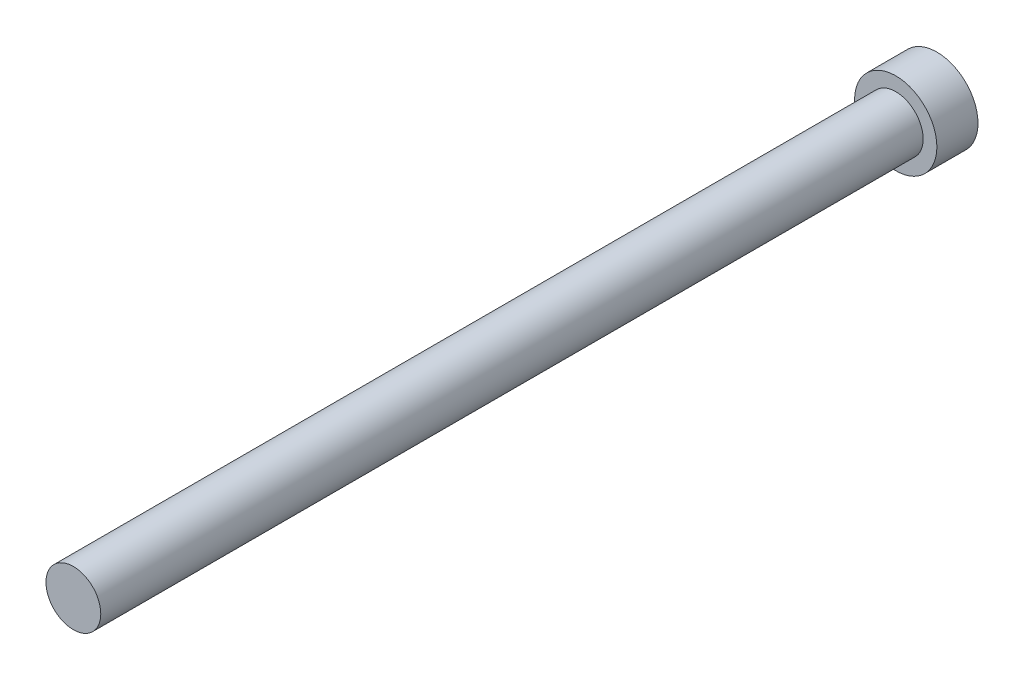
ISO-10303-21;
HEADER;
FILE_DESCRIPTION(('STEP AP214'),'2;1');
FILE_NAME('part.step','',(''),(''),'','','');
FILE_SCHEMA(('AUTOMOTIVE_DESIGN { 1 0 10303 214 1 1 1 1 }'));
ENDSEC;
DATA;
#1=APPLICATION_CONTEXT('core data for automotive mechanical design processes');
#2=APPLICATION_PROTOCOL_DEFINITION('international standard','automotive_design',2000,#1);
#3=PRODUCT_CONTEXT('',#1,'mechanical');
#4=PRODUCT('Part','Part','',(#3));
#5=PRODUCT_RELATED_PRODUCT_CATEGORY('part','',(#4));
#6=PRODUCT_DEFINITION_FORMATION('','',#4);
#7=PRODUCT_DEFINITION_CONTEXT('part definition',#1,'design');
#8=PRODUCT_DEFINITION('design','',#6,#7);
#9=PRODUCT_DEFINITION_SHAPE('','',#8);
#10=(LENGTH_UNIT() NAMED_UNIT(*) SI_UNIT(.MILLI.,.METRE.));
#11=(NAMED_UNIT(*) PLANE_ANGLE_UNIT() SI_UNIT($,.RADIAN.));
#12=(NAMED_UNIT(*) SI_UNIT($,.STERADIAN.) SOLID_ANGLE_UNIT());
#13=UNCERTAINTY_MEASURE_WITH_UNIT(LENGTH_MEASURE(1.E-05),#10,'distance_accuracy_value','');
#14=(GEOMETRIC_REPRESENTATION_CONTEXT(3) GLOBAL_UNCERTAINTY_ASSIGNED_CONTEXT((#13)) GLOBAL_UNIT_ASSIGNED_CONTEXT((#10,
#11,#12)) REPRESENTATION_CONTEXT('',''));
#15=CARTESIAN_POINT('',(0.,0.,0.));
#16=DIRECTION('',(0.,0.,1.));
#17=DIRECTION('',(1.,0.,0.));
#18=AXIS2_PLACEMENT_3D('',#15,#16,#17);
#19=CARTESIAN_POINT('',(0.,0.,6.));
#20=DIRECTION('',(0.,0.,1.));
#21=DIRECTION('',(1.,0.,0.));
#22=AXIS2_PLACEMENT_3D('',#19,#20,#21);
#23=PLANE('',#22);
#24=CARTESIAN_POINT('',(0.,0.,6.));
#25=DIRECTION('',(0.,0.,1.));
#26=DIRECTION('',(1.,0.,0.));
#27=AXIS2_PLACEMENT_3D('',#24,#25,#26);
#28=CIRCLE('',#27,6.);
#29=CARTESIAN_POINT('',(6.,0.,6.));
#30=VERTEX_POINT('',#29);
#31=EDGE_CURVE('E11',#30,#30,#28,.T.);
#32=ORIENTED_EDGE('',*,*,#31,.T.);
#33=EDGE_LOOP('',(#32));
#34=FACE_BOUND('',#33,.T.);
#35=CARTESIAN_POINT('',(0.,0.,6.));
#36=DIRECTION('',(0.,0.,1.));
#37=DIRECTION('',(1.,0.,0.));
#38=AXIS2_PLACEMENT_3D('',#35,#36,#37);
#39=CIRCLE('',#38,4.);
#40=CARTESIAN_POINT('',(4.,0.,6.));
#41=VERTEX_POINT('',#40);
#42=EDGE_CURVE('E168',#41,#41,#39,.T.);
#43=ORIENTED_EDGE('',*,*,#42,.F.);
#44=EDGE_LOOP('',(#43));
#45=FACE_BOUND('',#44,.T.);
#46=ADVANCED_FACE('F32',(#34,#45),#23,.T.);
#47=CARTESIAN_POINT('',(0.,0.,0.));
#48=DIRECTION('',(0.,0.,1.));
#49=DIRECTION('',(1.,0.,0.));
#50=AXIS2_PLACEMENT_3D('',#47,#48,#49);
#51=PLANE('',#50);
#52=CARTESIAN_POINT('',(0.,0.,0.));
#53=DIRECTION('',(0.,0.,1.));
#54=DIRECTION('',(1.,0.,0.));
#55=AXIS2_PLACEMENT_3D('',#52,#53,#54);
#56=CIRCLE('',#55,6.);
#57=CARTESIAN_POINT('',(6.,0.,0.));
#58=VERTEX_POINT('',#57);
#59=EDGE_CURVE('E36',#58,#58,#56,.T.);
#60=ORIENTED_EDGE('',*,*,#59,.F.);
#61=EDGE_LOOP('',(#60));
#62=FACE_BOUND('',#61,.T.);
#63=DIRECTION('',(0.5,0.866025403784439,0.));
#64=VECTOR('',#63,1.);
#65=CARTESIAN_POINT('',(1.73205080756888,-3.,0.));
#66=LINE('',#65,#64);
#67=CARTESIAN_POINT('',(1.73205080756888,-3.,0.));
#68=VERTEX_POINT('',#67);
#69=CARTESIAN_POINT('',(3.46410161513775,0.,0.));
#70=VERTEX_POINT('',#69);
#71=EDGE_CURVE('E47',#68,#70,#66,.T.);
#72=ORIENTED_EDGE('',*,*,#71,.T.);
#73=DIRECTION('',(-0.5,0.866025403784439,0.));
#74=VECTOR('',#73,1.);
#75=CARTESIAN_POINT('',(3.46410161513775,0.,0.));
#76=LINE('',#75,#74);
#77=CARTESIAN_POINT('',(1.73205080756888,3.,0.));
#78=VERTEX_POINT('',#77);
#79=EDGE_CURVE('E107',#70,#78,#76,.T.);
#80=ORIENTED_EDGE('',*,*,#79,.T.);
#81=DIRECTION('',(-1.,0.,0.));
#82=VECTOR('',#81,1.);
#83=CARTESIAN_POINT('',(1.73205080756888,3.,0.));
#84=LINE('',#83,#82);
#85=CARTESIAN_POINT('',(-1.73205080756888,3.,0.));
#86=VERTEX_POINT('',#85);
#87=EDGE_CURVE('E105',#78,#86,#84,.T.);
#88=ORIENTED_EDGE('',*,*,#87,.T.);
#89=DIRECTION('',(-0.5,-0.866025403784439,0.));
#90=VECTOR('',#89,1.);
#91=CARTESIAN_POINT('',(-1.73205080756888,3.,0.));
#92=LINE('',#91,#90);
#93=CARTESIAN_POINT('',(-3.46410161513776,0.,0.));
#94=VERTEX_POINT('',#93);
#95=EDGE_CURVE('E83',#86,#94,#92,.T.);
#96=ORIENTED_EDGE('',*,*,#95,.T.);
#97=DIRECTION('',(0.5,-0.866025403784439,0.));
#98=VECTOR('',#97,1.);
#99=CARTESIAN_POINT('',(-3.46410161513776,0.,0.));
#100=LINE('',#99,#98);
#101=CARTESIAN_POINT('',(-1.73205080756888,-3.,0.));
#102=VERTEX_POINT('',#101);
#103=EDGE_CURVE('E94',#94,#102,#100,.T.);
#104=ORIENTED_EDGE('',*,*,#103,.T.);
#105=DIRECTION('',(1.,0.,0.));
#106=VECTOR('',#105,1.);
#107=CARTESIAN_POINT('',(-1.73205080756888,-3.,0.));
#108=LINE('',#107,#106);
#109=EDGE_CURVE('E100',#102,#68,#108,.T.);
#110=ORIENTED_EDGE('',*,*,#109,.T.);
#111=EDGE_LOOP('',(#72,#80,#88,#96,#104,#110));
#112=FACE_BOUND('',#111,.T.);
#113=ADVANCED_FACE('F102',(#62,#112),#51,.F.);
#114=CARTESIAN_POINT('',(0.,0.,6.));
#115=DIRECTION('',(0.,0.,-1.));
#116=DIRECTION('',(-1.,0.,0.));
#117=AXIS2_PLACEMENT_3D('',#114,#115,#116);
#118=CYLINDRICAL_SURFACE('',#117,6.);
#119=ORIENTED_EDGE('',*,*,#31,.F.);
#120=EDGE_LOOP('',(#119));
#121=FACE_BOUND('',#120,.T.);
#122=ORIENTED_EDGE('',*,*,#59,.T.);
#123=EDGE_LOOP('',(#122));
#124=FACE_BOUND('',#123,.T.);
#125=ADVANCED_FACE('F34',(#121,#124),#118,.T.);
#126=CARTESIAN_POINT('',(1.73205080756888,-3.,6.));
#127=DIRECTION('',(-0.866025403784439,0.5,0.));
#128=DIRECTION('',(-0.5,-0.866025403784439,0.));
#129=AXIS2_PLACEMENT_3D('',#126,#127,#128);
#130=PLANE('',#129);
#131=ORIENTED_EDGE('',*,*,#71,.F.);
#132=DIRECTION('',(0.,0.,-1.));
#133=VECTOR('',#132,1.);
#134=CARTESIAN_POINT('',(1.73205080756888,-3.,6.));
#135=LINE('',#134,#133);
#136=CARTESIAN_POINT('',(1.73205080756888,-3.,6.));
#137=VERTEX_POINT('',#136);
#138=EDGE_CURVE('E112',#137,#68,#135,.T.);
#139=ORIENTED_EDGE('',*,*,#138,.F.);
#140=DIRECTION('',(0.5,0.866025403784439,0.));
#141=VECTOR('',#140,1.);
#142=CARTESIAN_POINT('',(1.73205080756888,-3.,6.));
#143=LINE('',#142,#141);
#144=CARTESIAN_POINT('',(3.46410161513775,0.,6.));
#145=VERTEX_POINT('',#144);
#146=EDGE_CURVE('E56',#137,#145,#143,.T.);
#147=ORIENTED_EDGE('',*,*,#146,.T.);
#148=DIRECTION('',(0.,0.,-1.));
#149=VECTOR('',#148,1.);
#150=CARTESIAN_POINT('',(3.46410161513775,0.,6.));
#151=LINE('',#150,#149);
#152=EDGE_CURVE('E119',#145,#70,#151,.T.);
#153=ORIENTED_EDGE('',*,*,#152,.T.);
#154=EDGE_LOOP('',(#131,#139,#147,#153));
#155=FACE_BOUND('',#154,.T.);
#156=ADVANCED_FACE('F130',(#155),#130,.T.);
#157=CARTESIAN_POINT('',(3.46410161513775,0.,6.));
#158=DIRECTION('',(-0.866025403784438,-0.5,0.));
#159=DIRECTION('',(0.5,-0.866025403784439,0.));
#160=AXIS2_PLACEMENT_3D('',#157,#158,#159);
#161=PLANE('',#160);
#162=ORIENTED_EDGE('',*,*,#79,.F.);
#163=ORIENTED_EDGE('',*,*,#152,.F.);
#164=DIRECTION('',(-0.5,0.866025403784439,0.));
#165=VECTOR('',#164,1.);
#166=CARTESIAN_POINT('',(3.46410161513775,0.,6.));
#167=LINE('',#166,#165);
#168=CARTESIAN_POINT('',(1.73205080756888,3.,6.));
#169=VERTEX_POINT('',#168);
#170=EDGE_CURVE('E175',#145,#169,#167,.T.);
#171=ORIENTED_EDGE('',*,*,#170,.T.);
#172=DIRECTION('',(0.,0.,-1.));
#173=VECTOR('',#172,1.);
#174=CARTESIAN_POINT('',(1.73205080756888,3.,6.));
#175=LINE('',#174,#173);
#176=EDGE_CURVE('E117',#169,#78,#175,.T.);
#177=ORIENTED_EDGE('',*,*,#176,.T.);
#178=EDGE_LOOP('',(#162,#163,#171,#177));
#179=FACE_BOUND('',#178,.T.);
#180=ADVANCED_FACE('F137',(#179),#161,.T.);
#181=CARTESIAN_POINT('',(1.73205080756888,3.,6.));
#182=DIRECTION('',(0.,-1.,0.));
#183=DIRECTION('',(0.,0.,-1.));
#184=AXIS2_PLACEMENT_3D('',#181,#182,#183);
#185=PLANE('',#184);
#186=ORIENTED_EDGE('',*,*,#87,.F.);
#187=ORIENTED_EDGE('',*,*,#176,.F.);
#188=DIRECTION('',(-1.,0.,0.));
#189=VECTOR('',#188,1.);
#190=CARTESIAN_POINT('',(1.73205080756888,3.,6.));
#191=LINE('',#190,#189);
#192=CARTESIAN_POINT('',(-1.73205080756888,3.,6.));
#193=VERTEX_POINT('',#192);
#194=EDGE_CURVE('E178',#169,#193,#191,.T.);
#195=ORIENTED_EDGE('',*,*,#194,.T.);
#196=DIRECTION('',(0.,0.,-1.));
#197=VECTOR('',#196,1.);
#198=CARTESIAN_POINT('',(-1.73205080756888,3.,6.));
#199=LINE('',#198,#197);
#200=EDGE_CURVE('E90',#193,#86,#199,.T.);
#201=ORIENTED_EDGE('',*,*,#200,.T.);
#202=EDGE_LOOP('',(#186,#187,#195,#201));
#203=FACE_BOUND('',#202,.T.);
#204=ADVANCED_FACE('F140',(#203),#185,.T.);
#205=CARTESIAN_POINT('',(-1.73205080756888,3.,6.));
#206=DIRECTION('',(0.866025403784439,-0.5,0.));
#207=DIRECTION('',(0.5,0.866025403784439,0.));
#208=AXIS2_PLACEMENT_3D('',#205,#206,#207);
#209=PLANE('',#208);
#210=ORIENTED_EDGE('',*,*,#95,.F.);
#211=ORIENTED_EDGE('',*,*,#200,.F.);
#212=DIRECTION('',(-0.5,-0.866025403784439,0.));
#213=VECTOR('',#212,1.);
#214=CARTESIAN_POINT('',(-1.73205080756888,3.,6.));
#215=LINE('',#214,#213);
#216=CARTESIAN_POINT('',(-3.46410161513776,0.,6.));
#217=VERTEX_POINT('',#216);
#218=EDGE_CURVE('E87',#193,#217,#215,.T.);
#219=ORIENTED_EDGE('',*,*,#218,.T.);
#220=DIRECTION('',(0.,0.,-1.));
#221=VECTOR('',#220,1.);
#222=CARTESIAN_POINT('',(-3.46410161513776,0.,6.));
#223=LINE('',#222,#221);
#224=EDGE_CURVE('E78',#217,#94,#223,.T.);
#225=ORIENTED_EDGE('',*,*,#224,.T.);
#226=EDGE_LOOP('',(#210,#211,#219,#225));
#227=FACE_BOUND('',#226,.T.);
#228=ADVANCED_FACE('F80',(#227),#209,.T.);
#229=CARTESIAN_POINT('',(-3.46410161513776,0.,6.));
#230=DIRECTION('',(0.866025403784438,0.5,0.));
#231=DIRECTION('',(-0.5,0.866025403784439,0.));
#232=AXIS2_PLACEMENT_3D('',#229,#230,#231);
#233=PLANE('',#232);
#234=ORIENTED_EDGE('',*,*,#103,.F.);
#235=ORIENTED_EDGE('',*,*,#224,.F.);
#236=DIRECTION('',(0.5,-0.866025403784439,0.));
#237=VECTOR('',#236,1.);
#238=CARTESIAN_POINT('',(-3.46410161513776,0.,6.));
#239=LINE('',#238,#237);
#240=CARTESIAN_POINT('',(-1.73205080756888,-3.,6.));
#241=VERTEX_POINT('',#240);
#242=EDGE_CURVE('E182',#217,#241,#239,.T.);
#243=ORIENTED_EDGE('',*,*,#242,.T.);
#244=DIRECTION('',(0.,0.,-1.));
#245=VECTOR('',#244,1.);
#246=CARTESIAN_POINT('',(-1.73205080756888,-3.,6.));
#247=LINE('',#246,#245);
#248=EDGE_CURVE('E91',#241,#102,#247,.T.);
#249=ORIENTED_EDGE('',*,*,#248,.T.);
#250=EDGE_LOOP('',(#234,#235,#243,#249));
#251=FACE_BOUND('',#250,.T.);
#252=ADVANCED_FACE('F95',(#251),#233,.T.);
#253=CARTESIAN_POINT('',(-1.73205080756888,-3.,6.));
#254=DIRECTION('',(0.,1.,0.));
#255=DIRECTION('',(-1.,0.,0.));
#256=AXIS2_PLACEMENT_3D('',#253,#254,#255);
#257=PLANE('',#256);
#258=ORIENTED_EDGE('',*,*,#109,.F.);
#259=ORIENTED_EDGE('',*,*,#248,.F.);
#260=DIRECTION('',(1.,0.,0.));
#261=VECTOR('',#260,1.);
#262=CARTESIAN_POINT('',(-1.73205080756888,-3.,6.));
#263=LINE('',#262,#261);
#264=EDGE_CURVE('E114',#241,#137,#263,.T.);
#265=ORIENTED_EDGE('',*,*,#264,.T.);
#266=ORIENTED_EDGE('',*,*,#138,.T.);
#267=EDGE_LOOP('',(#258,#259,#265,#266));
#268=FACE_BOUND('',#267,.T.);
#269=ADVANCED_FACE('F149',(#268),#257,.T.);
#270=CARTESIAN_POINT('',(0.,0.,6.));
#271=DIRECTION('',(0.,0.,1.));
#272=DIRECTION('',(1.,0.,0.));
#273=AXIS2_PLACEMENT_3D('',#270,#271,#272);
#274=PLANE('',#273);
#275=ORIENTED_EDGE('',*,*,#146,.F.);
#276=ORIENTED_EDGE('',*,*,#264,.F.);
#277=ORIENTED_EDGE('',*,*,#242,.F.);
#278=ORIENTED_EDGE('',*,*,#218,.F.);
#279=ORIENTED_EDGE('',*,*,#194,.F.);
#280=ORIENTED_EDGE('',*,*,#170,.F.);
#281=EDGE_LOOP('',(#275,#276,#277,#278,#279,#280));
#282=FACE_BOUND('',#281,.T.);
#283=ADVANCED_FACE('F152',(#282),#274,.F.);
#284=CARTESIAN_POINT('',(0.,0.,126.));
#285=DIRECTION('',(0.,0.,-1.));
#286=DIRECTION('',(-1.,0.,0.));
#287=AXIS2_PLACEMENT_3D('',#284,#285,#286);
#288=CYLINDRICAL_SURFACE('',#287,4.);
#289=CARTESIAN_POINT('',(0.,0.,126.));
#290=DIRECTION('',(0.,0.,1.));
#291=DIRECTION('',(1.,0.,0.));
#292=AXIS2_PLACEMENT_3D('',#289,#290,#291);
#293=CIRCLE('',#292,4.);
#294=CARTESIAN_POINT('',(4.,0.,126.));
#295=VERTEX_POINT('',#294);
#296=EDGE_CURVE('E167',#295,#295,#293,.T.);
#297=ORIENTED_EDGE('',*,*,#296,.F.);
#298=EDGE_LOOP('',(#297));
#299=FACE_BOUND('',#298,.T.);
#300=ORIENTED_EDGE('',*,*,#42,.T.);
#301=EDGE_LOOP('',(#300));
#302=FACE_BOUND('',#301,.T.);
#303=ADVANCED_FACE('F154',(#299,#302),#288,.T.);
#304=CARTESIAN_POINT('',(0.,0.,126.));
#305=DIRECTION('',(0.,0.,1.));
#306=DIRECTION('',(1.,0.,0.));
#307=AXIS2_PLACEMENT_3D('',#304,#305,#306);
#308=PLANE('',#307);
#309=ORIENTED_EDGE('',*,*,#296,.T.);
#310=EDGE_LOOP('',(#309));
#311=FACE_BOUND('',#310,.T.);
#312=ADVANCED_FACE('F157',(#311),#308,.T.);
#313=CLOSED_SHELL('',(#46,#113,#125,#156,#180,#204,#228,#252,#269,#283,#303,#312));
#314=MANIFOLD_SOLID_BREP('B2',#313);
#315=ADVANCED_BREP_SHAPE_REPRESENTATION('',(#18,#314),#14);
#316=SHAPE_DEFINITION_REPRESENTATION(#9,#315);
ENDSEC;
END-ISO-10303-21;
